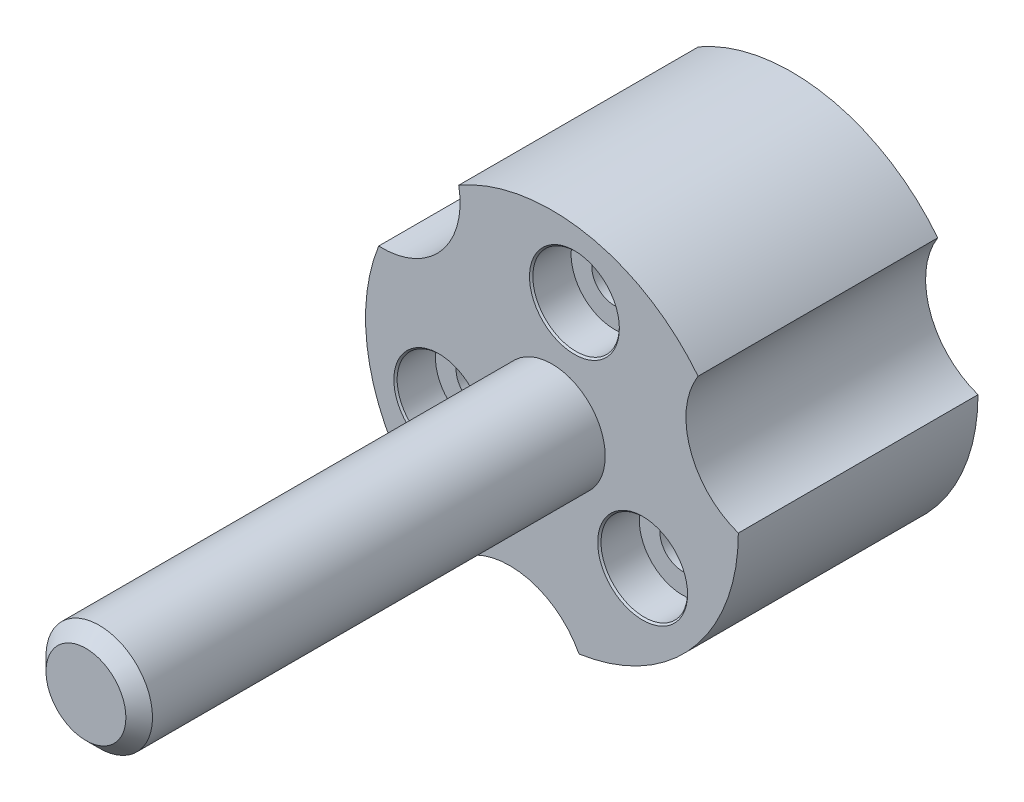
ISO-10303-21;
HEADER;
FILE_DESCRIPTION(('STEP AP214'),'2;1');
FILE_NAME('part.step','',(''),(''),'','','');
FILE_SCHEMA(('AUTOMOTIVE_DESIGN { 1 0 10303 214 1 1 1 1 }'));
ENDSEC;
DATA;
#1=APPLICATION_CONTEXT('core data for automotive mechanical design processes');
#2=APPLICATION_PROTOCOL_DEFINITION('international standard','automotive_design',2000,#1);
#3=PRODUCT_CONTEXT('',#1,'mechanical');
#4=PRODUCT('Part','Part','',(#3));
#5=PRODUCT_RELATED_PRODUCT_CATEGORY('part','',(#4));
#6=PRODUCT_DEFINITION_FORMATION('','',#4);
#7=PRODUCT_DEFINITION_CONTEXT('part definition',#1,'design');
#8=PRODUCT_DEFINITION('design','',#6,#7);
#9=PRODUCT_DEFINITION_SHAPE('','',#8);
#10=(LENGTH_UNIT() NAMED_UNIT(*) SI_UNIT(.MILLI.,.METRE.));
#11=(NAMED_UNIT(*) PLANE_ANGLE_UNIT() SI_UNIT($,.RADIAN.));
#12=(NAMED_UNIT(*) SI_UNIT($,.STERADIAN.) SOLID_ANGLE_UNIT());
#13=UNCERTAINTY_MEASURE_WITH_UNIT(LENGTH_MEASURE(1.E-05),#10,'distance_accuracy_value','');
#14=(GEOMETRIC_REPRESENTATION_CONTEXT(3) GLOBAL_UNCERTAINTY_ASSIGNED_CONTEXT((#13)) GLOBAL_UNIT_ASSIGNED_CONTEXT((#10,
#11,#12)) REPRESENTATION_CONTEXT('',''));
#15=CARTESIAN_POINT('',(0.,0.,0.));
#16=DIRECTION('',(0.,0.,1.));
#17=DIRECTION('',(1.,0.,0.));
#18=AXIS2_PLACEMENT_3D('',#15,#16,#17);
#19=CARTESIAN_POINT('',(-3.16654920409243,-16.571487525007,18.));
#20=DIRECTION('',(0.,0.,-1.));
#21=DIRECTION('',(-1.,0.,0.));
#22=AXIS2_PLACEMENT_3D('',#19,#20,#21);
#23=CYLINDRICAL_SURFACE('',#22,5.87131389825349);
#24=CARTESIAN_POINT('',(-3.16654920409243,-16.571487525007,0.));
#25=DIRECTION('',(0.,0.,1.));
#26=DIRECTION('',(1.,0.,0.));
#27=AXIS2_PLACEMENT_3D('',#24,#25,#26);
#28=CIRCLE('',#27,5.87131389825349);
#29=CARTESIAN_POINT('',(-7.00000000000006,-12.1243556529821,0.));
#30=VERTEX_POINT('',#29);
#31=CARTESIAN_POINT('',(2.03650338968833,-13.851088547251,0.));
#32=VERTEX_POINT('',#31);
#33=EDGE_CURVE('E123',#30,#32,#28,.F.);
#34=ORIENTED_EDGE('',*,*,#33,.T.);
#35=DIRECTION('',(0.,0.,-1.));
#36=VECTOR('',#35,1.);
#37=CARTESIAN_POINT('',(2.03650338968833,-13.851088547251,18.));
#38=LINE('',#37,#36);
#39=CARTESIAN_POINT('',(2.03650338968833,-13.851088547251,18.));
#40=VERTEX_POINT('',#39);
#41=EDGE_CURVE('E141',#40,#32,#38,.T.);
#42=ORIENTED_EDGE('',*,*,#41,.F.);
#43=CARTESIAN_POINT('',(-3.16654920409243,-16.571487525007,18.));
#44=DIRECTION('',(0.,0.,1.));
#45=DIRECTION('',(1.,0.,0.));
#46=AXIS2_PLACEMENT_3D('',#43,#44,#45);
#47=CIRCLE('',#46,5.87131389825349);
#48=CARTESIAN_POINT('',(-7.00000000000006,-12.1243556529821,18.));
#49=VERTEX_POINT('',#48);
#50=EDGE_CURVE('E134',#49,#40,#47,.F.);
#51=ORIENTED_EDGE('',*,*,#50,.F.);
#52=DIRECTION('',(0.,0.,-1.));
#53=VECTOR('',#52,1.);
#54=CARTESIAN_POINT('',(-7.00000000000006,-12.1243556529821,18.));
#55=LINE('',#54,#53);
#56=EDGE_CURVE('E119',#49,#30,#55,.T.);
#57=ORIENTED_EDGE('',*,*,#56,.T.);
#58=EDGE_LOOP('',(#34,#42,#51,#57));
#59=FACE_BOUND('',#58,.T.);
#60=ADVANCED_FACE('F36',(#59),#23,.F.);
#61=CARTESIAN_POINT('',(0.,0.,18.));
#62=DIRECTION('',(0.,0.,-1.));
#63=DIRECTION('',(-1.,0.,0.));
#64=AXIS2_PLACEMENT_3D('',#61,#62,#63);
#65=CYLINDRICAL_SURFACE('',#64,14.);
#66=CARTESIAN_POINT('',(0.,0.,0.));
#67=DIRECTION('',(0.,0.,1.));
#68=DIRECTION('',(1.,0.,0.));
#69=AXIS2_PLACEMENT_3D('',#66,#67,#68);
#70=CIRCLE('',#69,14.);
#71=CARTESIAN_POINT('',(14.,0.,0.));
#72=VERTEX_POINT('',#71);
#73=EDGE_CURVE('E126',#32,#72,#70,.T.);
#74=ORIENTED_EDGE('',*,*,#73,.T.);
#75=DIRECTION('',(0.,0.,-1.));
#76=VECTOR('',#75,1.);
#77=CARTESIAN_POINT('',(14.,0.,18.));
#78=LINE('',#77,#76);
#79=CARTESIAN_POINT('',(14.,0.,18.));
#80=VERTEX_POINT('',#79);
#81=EDGE_CURVE('E138',#80,#72,#78,.T.);
#82=ORIENTED_EDGE('',*,*,#81,.F.);
#83=CARTESIAN_POINT('',(0.,0.,18.));
#84=DIRECTION('',(0.,0.,1.));
#85=DIRECTION('',(1.,0.,0.));
#86=AXIS2_PLACEMENT_3D('',#83,#84,#85);
#87=CIRCLE('',#86,14.);
#88=EDGE_CURVE('E92',#40,#80,#87,.T.);
#89=ORIENTED_EDGE('',*,*,#88,.F.);
#90=ORIENTED_EDGE('',*,*,#41,.T.);
#91=EDGE_LOOP('',(#74,#82,#89,#90));
#92=FACE_BOUND('',#91,.T.);
#93=ADVANCED_FACE('F157',(#92),#65,.T.);
#94=CARTESIAN_POINT('',(15.9346037771992,5.54343170942614,18.));
#95=DIRECTION('',(0.,0.,-1.));
#96=DIRECTION('',(-1.,0.,0.));
#97=AXIS2_PLACEMENT_3D('',#94,#95,#96);
#98=CYLINDRICAL_SURFACE('',#97,5.87131389825349);
#99=CARTESIAN_POINT('',(15.9346037771992,5.54343170942614,0.));
#100=DIRECTION('',(0.,0.,1.));
#101=DIRECTION('',(1.,0.,0.));
#102=AXIS2_PLACEMENT_3D('',#99,#100,#101);
#103=CIRCLE('',#102,5.87131389825349);
#104=CARTESIAN_POINT('',(10.9771428571429,8.68920794398877,0.));
#105=VERTEX_POINT('',#104);
#106=EDGE_CURVE('E129',#72,#105,#103,.F.);
#107=ORIENTED_EDGE('',*,*,#106,.T.);
#108=DIRECTION('',(0.,0.,-1.));
#109=VECTOR('',#108,1.);
#110=CARTESIAN_POINT('',(10.9771428571429,8.68920794398877,18.));
#111=LINE('',#110,#109);
#112=CARTESIAN_POINT('',(10.9771428571429,8.68920794398877,18.));
#113=VERTEX_POINT('',#112);
#114=EDGE_CURVE('E114',#113,#105,#111,.T.);
#115=ORIENTED_EDGE('',*,*,#114,.F.);
#116=CARTESIAN_POINT('',(15.9346037771992,5.54343170942614,18.));
#117=DIRECTION('',(0.,0.,1.));
#118=DIRECTION('',(1.,0.,0.));
#119=AXIS2_PLACEMENT_3D('',#116,#117,#118);
#120=CIRCLE('',#119,5.87131389825349);
#121=EDGE_CURVE('E105',#80,#113,#120,.F.);
#122=ORIENTED_EDGE('',*,*,#121,.F.);
#123=ORIENTED_EDGE('',*,*,#81,.T.);
#124=EDGE_LOOP('',(#107,#115,#122,#123));
#125=FACE_BOUND('',#124,.T.);
#126=ADVANCED_FACE('F160',(#125),#98,.F.);
#127=CARTESIAN_POINT('',(0.,0.,18.));
#128=DIRECTION('',(0.,0.,-1.));
#129=DIRECTION('',(-1.,0.,0.));
#130=AXIS2_PLACEMENT_3D('',#127,#128,#129);
#131=CYLINDRICAL_SURFACE('',#130,14.);
#132=CARTESIAN_POINT('',(0.,0.,0.));
#133=DIRECTION('',(0.,0.,1.));
#134=DIRECTION('',(1.,0.,0.));
#135=AXIS2_PLACEMENT_3D('',#132,#133,#134);
#136=CIRCLE('',#135,14.);
#137=CARTESIAN_POINT('',(-6.99999999999988,12.1243556529822,0.));
#138=VERTEX_POINT('',#137);
#139=EDGE_CURVE('E113',#105,#138,#136,.T.);
#140=ORIENTED_EDGE('',*,*,#139,.T.);
#141=DIRECTION('',(0.,0.,-1.));
#142=VECTOR('',#141,1.);
#143=CARTESIAN_POINT('',(-6.99999999999988,12.1243556529822,18.));
#144=LINE('',#143,#142);
#145=CARTESIAN_POINT('',(-6.99999999999988,12.1243556529822,18.));
#146=VERTEX_POINT('',#145);
#147=EDGE_CURVE('E110',#146,#138,#144,.T.);
#148=ORIENTED_EDGE('',*,*,#147,.F.);
#149=CARTESIAN_POINT('',(0.,0.,18.));
#150=DIRECTION('',(0.,0.,1.));
#151=DIRECTION('',(1.,0.,0.));
#152=AXIS2_PLACEMENT_3D('',#149,#150,#151);
#153=CIRCLE('',#152,14.);
#154=EDGE_CURVE('E99',#113,#146,#153,.T.);
#155=ORIENTED_EDGE('',*,*,#154,.F.);
#156=ORIENTED_EDGE('',*,*,#114,.T.);
#157=EDGE_LOOP('',(#140,#148,#155,#156));
#158=FACE_BOUND('',#157,.T.);
#159=ADVANCED_FACE('F111',(#158),#131,.T.);
#160=CARTESIAN_POINT('',(-12.7680545731067,11.028055815581,18.));
#161=DIRECTION('',(0.,0.,-1.));
#162=DIRECTION('',(-1.,0.,0.));
#163=AXIS2_PLACEMENT_3D('',#160,#161,#162);
#164=CYLINDRICAL_SURFACE('',#163,5.87131389825349);
#165=CARTESIAN_POINT('',(-12.7680545731067,11.028055815581,0.));
#166=DIRECTION('',(0.,0.,1.));
#167=DIRECTION('',(1.,0.,0.));
#168=AXIS2_PLACEMENT_3D('',#165,#166,#167);
#169=CIRCLE('',#168,5.87131389825349);
#170=CARTESIAN_POINT('',(-13.0136462468312,5.16188060326235,0.));
#171=VERTEX_POINT('',#170);
#172=EDGE_CURVE('E77',#138,#171,#169,.F.);
#173=ORIENTED_EDGE('',*,*,#172,.T.);
#174=DIRECTION('',(0.,0.,-1.));
#175=VECTOR('',#174,1.);
#176=CARTESIAN_POINT('',(-13.0136462468312,5.16188060326235,18.));
#177=LINE('',#176,#175);
#178=CARTESIAN_POINT('',(-13.0136462468312,5.16188060326235,18.));
#179=VERTEX_POINT('',#178);
#180=EDGE_CURVE('E115',#179,#171,#177,.T.);
#181=ORIENTED_EDGE('',*,*,#180,.F.);
#182=CARTESIAN_POINT('',(-12.7680545731067,11.028055815581,18.));
#183=DIRECTION('',(0.,0.,1.));
#184=DIRECTION('',(1.,0.,0.));
#185=AXIS2_PLACEMENT_3D('',#182,#183,#184);
#186=CIRCLE('',#185,5.87131389825349);
#187=EDGE_CURVE('E103',#146,#179,#186,.F.);
#188=ORIENTED_EDGE('',*,*,#187,.F.);
#189=ORIENTED_EDGE('',*,*,#147,.T.);
#190=EDGE_LOOP('',(#173,#181,#188,#189));
#191=FACE_BOUND('',#190,.T.);
#192=ADVANCED_FACE('F117',(#191),#164,.F.);
#193=CARTESIAN_POINT('',(0.,0.,18.));
#194=DIRECTION('',(0.,0.,-1.));
#195=DIRECTION('',(-1.,0.,0.));
#196=AXIS2_PLACEMENT_3D('',#193,#194,#195);
#197=CYLINDRICAL_SURFACE('',#196,14.);
#198=CARTESIAN_POINT('',(0.,0.,0.));
#199=DIRECTION('',(0.,0.,1.));
#200=DIRECTION('',(1.,0.,0.));
#201=AXIS2_PLACEMENT_3D('',#198,#199,#200);
#202=CIRCLE('',#201,14.);
#203=EDGE_CURVE('E83',#171,#30,#202,.T.);
#204=ORIENTED_EDGE('',*,*,#203,.T.);
#205=ORIENTED_EDGE('',*,*,#56,.F.);
#206=CARTESIAN_POINT('',(0.,0.,18.));
#207=DIRECTION('',(0.,0.,1.));
#208=DIRECTION('',(1.,0.,0.));
#209=AXIS2_PLACEMENT_3D('',#206,#207,#208);
#210=CIRCLE('',#209,14.);
#211=EDGE_CURVE('E54',#179,#49,#210,.T.);
#212=ORIENTED_EDGE('',*,*,#211,.F.);
#213=ORIENTED_EDGE('',*,*,#180,.T.);
#214=EDGE_LOOP('',(#204,#205,#212,#213));
#215=FACE_BOUND('',#214,.T.);
#216=ADVANCED_FACE('F165',(#215),#197,.T.);
#217=CARTESIAN_POINT('',(0.,0.,18.));
#218=DIRECTION('',(0.,0.,1.));
#219=DIRECTION('',(1.,0.,0.));
#220=AXIS2_PLACEMENT_3D('',#217,#218,#219);
#221=PLANE('',#220);
#222=CARTESIAN_POINT('',(-8.50031211911943,-2.95714285714291,18.));
#223=DIRECTION('',(0.,0.,1.));
#224=DIRECTION('',(1.,0.,0.));
#225=AXIS2_PLACEMENT_3D('',#222,#223,#224);
#226=CIRCLE('',#225,3.375);
#227=CARTESIAN_POINT('',(-5.12531211911943,-2.95714285714291,18.));
#228=VERTEX_POINT('',#227);
#229=EDGE_CURVE('E414',#228,#228,#226,.T.);
#230=ORIENTED_EDGE('',*,*,#229,.F.);
#231=EDGE_LOOP('',(#230));
#232=FACE_BOUND('',#231,.T.);
#233=CARTESIAN_POINT('',(1.6891952226543,8.84005766382561,18.));
#234=DIRECTION('',(0.,0.,1.));
#235=DIRECTION('',(1.,0.,0.));
#236=AXIS2_PLACEMENT_3D('',#233,#234,#235);
#237=CIRCLE('',#236,3.375);
#238=CARTESIAN_POINT('',(5.06419522265429,8.84005766382561,18.));
#239=VERTEX_POINT('',#238);
#240=EDGE_CURVE('E431',#239,#239,#237,.T.);
#241=ORIENTED_EDGE('',*,*,#240,.F.);
#242=EDGE_LOOP('',(#241));
#243=FACE_BOUND('',#242,.T.);
#244=CARTESIAN_POINT('',(6.81111689646512,-5.88291480668277,18.));
#245=DIRECTION('',(0.,0.,1.));
#246=DIRECTION('',(1.,0.,0.));
#247=AXIS2_PLACEMENT_3D('',#244,#245,#246);
#248=CIRCLE('',#247,3.375);
#249=CARTESIAN_POINT('',(10.1861168964651,-5.88291480668277,18.));
#250=VERTEX_POINT('',#249);
#251=EDGE_CURVE('E446',#250,#250,#248,.T.);
#252=ORIENTED_EDGE('',*,*,#251,.F.);
#253=EDGE_LOOP('',(#252));
#254=FACE_BOUND('',#253,.T.);
#255=CARTESIAN_POINT('',(0.,0.,18.));
#256=DIRECTION('',(0.,0.,1.));
#257=DIRECTION('',(1.,0.,0.));
#258=AXIS2_PLACEMENT_3D('',#255,#256,#257);
#259=CIRCLE('',#258,4.);
#260=CARTESIAN_POINT('',(4.,0.,18.));
#261=VERTEX_POINT('',#260);
#262=EDGE_CURVE('E143',#261,#261,#259,.T.);
#263=ORIENTED_EDGE('',*,*,#262,.F.);
#264=EDGE_LOOP('',(#263));
#265=FACE_BOUND('',#264,.T.);
#266=ORIENTED_EDGE('',*,*,#50,.T.);
#267=ORIENTED_EDGE('',*,*,#88,.T.);
#268=ORIENTED_EDGE('',*,*,#121,.T.);
#269=ORIENTED_EDGE('',*,*,#154,.T.);
#270=ORIENTED_EDGE('',*,*,#187,.T.);
#271=ORIENTED_EDGE('',*,*,#211,.T.);
#272=EDGE_LOOP('',(#266,#267,#268,#269,#270,#271));
#273=FACE_BOUND('',#272,.T.);
#274=ADVANCED_FACE('F101',(#232,#243,#254,#265,#273),#221,.T.);
#275=CARTESIAN_POINT('',(0.,0.,0.));
#276=DIRECTION('',(0.,0.,1.));
#277=DIRECTION('',(1.,0.,0.));
#278=AXIS2_PLACEMENT_3D('',#275,#276,#277);
#279=PLANE('',#278);
#280=CARTESIAN_POINT('',(0.,0.,0.));
#281=DIRECTION('',(0.,0.,-1.));
#282=DIRECTION('',(-1.,0.,0.));
#283=AXIS2_PLACEMENT_3D('',#280,#281,#282);
#284=CIRCLE('',#283,6.);
#285=CARTESIAN_POINT('',(-6.,0.,0.));
#286=VERTEX_POINT('',#285);
#287=EDGE_CURVE('E409',#286,#286,#284,.T.);
#288=ORIENTED_EDGE('',*,*,#287,.F.);
#289=EDGE_LOOP('',(#288));
#290=FACE_BOUND('',#289,.T.);
#291=CARTESIAN_POINT('',(-8.50031211911943,-2.95714285714291,0.));
#292=DIRECTION('',(0.,0.,1.));
#293=DIRECTION('',(1.,0.,0.));
#294=AXIS2_PLACEMENT_3D('',#291,#292,#293);
#295=CIRCLE('',#294,1.7);
#296=CARTESIAN_POINT('',(-6.80031211911943,-2.95714285714291,0.));
#297=VERTEX_POINT('',#296);
#298=EDGE_CURVE('E428',#297,#297,#295,.T.);
#299=ORIENTED_EDGE('',*,*,#298,.T.);
#300=EDGE_LOOP('',(#299));
#301=FACE_BOUND('',#300,.T.);
#302=CARTESIAN_POINT('',(1.6891952226543,8.84005766382561,0.));
#303=DIRECTION('',(0.,0.,1.));
#304=DIRECTION('',(1.,0.,0.));
#305=AXIS2_PLACEMENT_3D('',#302,#303,#304);
#306=CIRCLE('',#305,1.7);
#307=CARTESIAN_POINT('',(3.38919522265429,8.84005766382561,0.));
#308=VERTEX_POINT('',#307);
#309=EDGE_CURVE('E443',#308,#308,#306,.T.);
#310=ORIENTED_EDGE('',*,*,#309,.T.);
#311=EDGE_LOOP('',(#310));
#312=FACE_BOUND('',#311,.T.);
#313=CARTESIAN_POINT('',(6.81111689646512,-5.88291480668277,0.));
#314=DIRECTION('',(0.,0.,1.));
#315=DIRECTION('',(1.,0.,0.));
#316=AXIS2_PLACEMENT_3D('',#313,#314,#315);
#317=CIRCLE('',#316,1.69999999999999);
#318=CARTESIAN_POINT('',(8.51111689646511,-5.88291480668277,0.));
#319=VERTEX_POINT('',#318);
#320=EDGE_CURVE('E127',#319,#319,#317,.T.);
#321=ORIENTED_EDGE('',*,*,#320,.T.);
#322=EDGE_LOOP('',(#321));
#323=FACE_BOUND('',#322,.T.);
#324=ORIENTED_EDGE('',*,*,#33,.F.);
#325=ORIENTED_EDGE('',*,*,#203,.F.);
#326=ORIENTED_EDGE('',*,*,#172,.F.);
#327=ORIENTED_EDGE('',*,*,#139,.F.);
#328=ORIENTED_EDGE('',*,*,#106,.F.);
#329=ORIENTED_EDGE('',*,*,#73,.F.);
#330=EDGE_LOOP('',(#324,#325,#326,#327,#328,#329));
#331=FACE_BOUND('',#330,.T.);
#332=ADVANCED_FACE('F163',(#290,#301,#312,#323,#331),#279,.F.);
#333=CARTESIAN_POINT('',(0.,0.,53.));
#334=DIRECTION('',(0.,0.,-1.));
#335=DIRECTION('',(-1.,0.,0.));
#336=AXIS2_PLACEMENT_3D('',#333,#334,#335);
#337=CYLINDRICAL_SURFACE('',#336,4.);
#338=CARTESIAN_POINT('',(0.,0.,52.));
#339=DIRECTION('',(0.,0.,1.));
#340=DIRECTION('',(1.,0.,0.));
#341=AXIS2_PLACEMENT_3D('',#338,#339,#340);
#342=CIRCLE('',#341,4.);
#343=CARTESIAN_POINT('',(4.,0.,52.));
#344=VERTEX_POINT('',#343);
#345=EDGE_CURVE('E11',#344,#344,#342,.F.);
#346=ORIENTED_EDGE('',*,*,#345,.T.);
#347=EDGE_LOOP('',(#346));
#348=FACE_BOUND('',#347,.T.);
#349=ORIENTED_EDGE('',*,*,#262,.T.);
#350=EDGE_LOOP('',(#349));
#351=FACE_BOUND('',#350,.T.);
#352=ADVANCED_FACE('F203',(#348,#351),#337,.T.);
#353=CARTESIAN_POINT('',(0.,0.,53.));
#354=DIRECTION('',(0.,0.,1.));
#355=DIRECTION('',(1.,0.,0.));
#356=AXIS2_PLACEMENT_3D('',#353,#354,#355);
#357=PLANE('',#356);
#358=CARTESIAN_POINT('',(0.,0.,53.));
#359=DIRECTION('',(0.,0.,1.));
#360=DIRECTION('',(1.,0.,0.));
#361=AXIS2_PLACEMENT_3D('',#358,#359,#360);
#362=CIRCLE('',#361,2.99999999999999);
#363=CARTESIAN_POINT('',(2.99999999999999,0.,53.));
#364=VERTEX_POINT('',#363);
#365=EDGE_CURVE('E46',#364,#364,#362,.T.);
#366=ORIENTED_EDGE('',*,*,#365,.T.);
#367=EDGE_LOOP('',(#366));
#368=FACE_BOUND('',#367,.T.);
#369=ADVANCED_FACE('F209',(#368),#357,.T.);
#370=CARTESIAN_POINT('',(0.,0.,53.));
#371=DIRECTION('',(0.,0.,-1.));
#372=DIRECTION('',(-1.,0.,0.));
#373=AXIS2_PLACEMENT_3D('',#370,#371,#372);
#374=CONICAL_SURFACE('',#373,2.99999999999999,0.78539816339745);
#375=ORIENTED_EDGE('',*,*,#345,.F.);
#376=EDGE_LOOP('',(#375));
#377=FACE_BOUND('',#376,.T.);
#378=ORIENTED_EDGE('',*,*,#365,.F.);
#379=EDGE_LOOP('',(#378));
#380=FACE_BOUND('',#379,.T.);
#381=ADVANCED_FACE('F38',(#377,#380),#374,.T.);
#382=CARTESIAN_POINT('',(6.81111689646512,-5.88291480668277,18.));
#383=DIRECTION('',(0.,0.,1.));
#384=DIRECTION('',(1.,0.,0.));
#385=AXIS2_PLACEMENT_3D('',#382,#383,#384);
#386=CYLINDRICAL_SURFACE('',#385,1.7);
#387=ORIENTED_EDGE('',*,*,#320,.F.);
#388=EDGE_LOOP('',(#387));
#389=FACE_BOUND('',#388,.T.);
#390=CARTESIAN_POINT('',(6.81111689646512,-5.88291480668277,15.));
#391=DIRECTION('',(0.,0.,1.));
#392=DIRECTION('',(1.,0.,0.));
#393=AXIS2_PLACEMENT_3D('',#390,#391,#392);
#394=CIRCLE('',#393,1.7);
#395=CARTESIAN_POINT('',(8.51111689646512,-5.88291480668277,15.));
#396=VERTEX_POINT('',#395);
#397=EDGE_CURVE('E454',#396,#396,#394,.T.);
#398=ORIENTED_EDGE('',*,*,#397,.T.);
#399=EDGE_LOOP('',(#398));
#400=FACE_BOUND('',#399,.T.);
#401=ADVANCED_FACE('F227',(#389,#400),#386,.F.);
#402=CARTESIAN_POINT('',(10.0611168964651,-5.88291480668277,15.));
#403=DIRECTION('',(0.,0.,-1.));
#404=DIRECTION('',(-1.,0.,0.));
#405=AXIS2_PLACEMENT_3D('',#402,#403,#404);
#406=PLANE('',#405);
#407=ORIENTED_EDGE('',*,*,#397,.F.);
#408=EDGE_LOOP('',(#407));
#409=FACE_BOUND('',#408,.T.);
#410=CARTESIAN_POINT('',(6.81111689646512,-5.88291480668277,15.));
#411=DIRECTION('',(0.,0.,1.));
#412=DIRECTION('',(1.,0.,0.));
#413=AXIS2_PLACEMENT_3D('',#410,#411,#412);
#414=CIRCLE('',#413,3.25);
#415=CARTESIAN_POINT('',(10.0611168964651,-5.88291480668277,15.));
#416=VERTEX_POINT('',#415);
#417=EDGE_CURVE('E452',#416,#416,#414,.T.);
#418=ORIENTED_EDGE('',*,*,#417,.T.);
#419=EDGE_LOOP('',(#418));
#420=FACE_BOUND('',#419,.T.);
#421=ADVANCED_FACE('F236',(#409,#420),#406,.F.);
#422=CARTESIAN_POINT('',(6.81111689646512,-5.88291480668277,18.));
#423=DIRECTION('',(0.,0.,1.));
#424=DIRECTION('',(1.,0.,0.));
#425=AXIS2_PLACEMENT_3D('',#422,#423,#424);
#426=CYLINDRICAL_SURFACE('',#425,3.25);
#427=ORIENTED_EDGE('',*,*,#417,.F.);
#428=EDGE_LOOP('',(#427));
#429=FACE_BOUND('',#428,.T.);
#430=CARTESIAN_POINT('',(6.81111689646512,-5.88291480668277,17.875));
#431=DIRECTION('',(0.,0.,1.));
#432=DIRECTION('',(1.,0.,0.));
#433=AXIS2_PLACEMENT_3D('',#430,#431,#432);
#434=CIRCLE('',#433,3.25);
#435=CARTESIAN_POINT('',(10.0611168964651,-5.88291480668277,17.875));
#436=VERTEX_POINT('',#435);
#437=EDGE_CURVE('E449',#436,#436,#434,.T.);
#438=ORIENTED_EDGE('',*,*,#437,.T.);
#439=EDGE_LOOP('',(#438));
#440=FACE_BOUND('',#439,.T.);
#441=ADVANCED_FACE('F246',(#429,#440),#426,.F.);
#442=CARTESIAN_POINT('',(6.81111689646512,-5.88291480668277,18.));
#443=DIRECTION('',(0.,0.,1.));
#444=DIRECTION('',(1.,0.,0.));
#445=AXIS2_PLACEMENT_3D('',#442,#443,#444);
#446=CONICAL_SURFACE('',#445,3.375,0.785398163397448);
#447=ORIENTED_EDGE('',*,*,#437,.F.);
#448=EDGE_LOOP('',(#447));
#449=FACE_BOUND('',#448,.T.);
#450=ORIENTED_EDGE('',*,*,#251,.T.);
#451=EDGE_LOOP('',(#450));
#452=FACE_BOUND('',#451,.T.);
#453=ADVANCED_FACE('F256',(#449,#452),#446,.F.);
#454=CARTESIAN_POINT('',(1.6891952226543,8.84005766382561,18.));
#455=DIRECTION('',(0.,0.,1.));
#456=DIRECTION('',(1.,0.,0.));
#457=AXIS2_PLACEMENT_3D('',#454,#455,#456);
#458=CYLINDRICAL_SURFACE('',#457,1.7);
#459=ORIENTED_EDGE('',*,*,#309,.F.);
#460=EDGE_LOOP('',(#459));
#461=FACE_BOUND('',#460,.T.);
#462=CARTESIAN_POINT('',(1.6891952226543,8.84005766382561,15.));
#463=DIRECTION('',(0.,0.,1.));
#464=DIRECTION('',(1.,0.,0.));
#465=AXIS2_PLACEMENT_3D('',#462,#463,#464);
#466=CIRCLE('',#465,1.7);
#467=CARTESIAN_POINT('',(3.3891952226543,8.84005766382561,15.));
#468=VERTEX_POINT('',#467);
#469=EDGE_CURVE('E440',#468,#468,#466,.T.);
#470=ORIENTED_EDGE('',*,*,#469,.T.);
#471=EDGE_LOOP('',(#470));
#472=FACE_BOUND('',#471,.T.);
#473=ADVANCED_FACE('F266',(#461,#472),#458,.F.);
#474=CARTESIAN_POINT('',(4.93919522265429,8.84005766382561,15.));
#475=DIRECTION('',(0.,0.,-1.));
#476=DIRECTION('',(-1.,0.,0.));
#477=AXIS2_PLACEMENT_3D('',#474,#475,#476);
#478=PLANE('',#477);
#479=ORIENTED_EDGE('',*,*,#469,.F.);
#480=EDGE_LOOP('',(#479));
#481=FACE_BOUND('',#480,.T.);
#482=CARTESIAN_POINT('',(1.6891952226543,8.84005766382561,15.));
#483=DIRECTION('',(0.,0.,1.));
#484=DIRECTION('',(1.,0.,0.));
#485=AXIS2_PLACEMENT_3D('',#482,#483,#484);
#486=CIRCLE('',#485,3.25);
#487=CARTESIAN_POINT('',(4.93919522265429,8.84005766382561,15.));
#488=VERTEX_POINT('',#487);
#489=EDGE_CURVE('E437',#488,#488,#486,.T.);
#490=ORIENTED_EDGE('',*,*,#489,.T.);
#491=EDGE_LOOP('',(#490));
#492=FACE_BOUND('',#491,.T.);
#493=ADVANCED_FACE('F283',(#481,#492),#478,.F.);
#494=CARTESIAN_POINT('',(1.6891952226543,8.84005766382561,18.));
#495=DIRECTION('',(0.,0.,1.));
#496=DIRECTION('',(1.,0.,0.));
#497=AXIS2_PLACEMENT_3D('',#494,#495,#496);
#498=CYLINDRICAL_SURFACE('',#497,3.25);
#499=ORIENTED_EDGE('',*,*,#489,.F.);
#500=EDGE_LOOP('',(#499));
#501=FACE_BOUND('',#500,.T.);
#502=CARTESIAN_POINT('',(1.6891952226543,8.84005766382561,17.875));
#503=DIRECTION('',(0.,0.,1.));
#504=DIRECTION('',(1.,0.,0.));
#505=AXIS2_PLACEMENT_3D('',#502,#503,#504);
#506=CIRCLE('',#505,3.25);
#507=CARTESIAN_POINT('',(4.9391952226543,8.84005766382561,17.875));
#508=VERTEX_POINT('',#507);
#509=EDGE_CURVE('E434',#508,#508,#506,.T.);
#510=ORIENTED_EDGE('',*,*,#509,.T.);
#511=EDGE_LOOP('',(#510));
#512=FACE_BOUND('',#511,.T.);
#513=ADVANCED_FACE('F293',(#501,#512),#498,.F.);
#514=CARTESIAN_POINT('',(1.6891952226543,8.84005766382561,18.));
#515=DIRECTION('',(0.,0.,1.));
#516=DIRECTION('',(1.,0.,0.));
#517=AXIS2_PLACEMENT_3D('',#514,#515,#516);
#518=CONICAL_SURFACE('',#517,3.375,0.785398163397445);
#519=ORIENTED_EDGE('',*,*,#509,.F.);
#520=EDGE_LOOP('',(#519));
#521=FACE_BOUND('',#520,.T.);
#522=ORIENTED_EDGE('',*,*,#240,.T.);
#523=EDGE_LOOP('',(#522));
#524=FACE_BOUND('',#523,.T.);
#525=ADVANCED_FACE('F303',(#521,#524),#518,.F.);
#526=CARTESIAN_POINT('',(-8.50031211911943,-2.95714285714291,18.));
#527=DIRECTION('',(0.,0.,1.));
#528=DIRECTION('',(1.,0.,0.));
#529=AXIS2_PLACEMENT_3D('',#526,#527,#528);
#530=CYLINDRICAL_SURFACE('',#529,1.7);
#531=ORIENTED_EDGE('',*,*,#298,.F.);
#532=EDGE_LOOP('',(#531));
#533=FACE_BOUND('',#532,.T.);
#534=CARTESIAN_POINT('',(-8.50031211911943,-2.95714285714291,15.));
#535=DIRECTION('',(0.,0.,1.));
#536=DIRECTION('',(1.,0.,0.));
#537=AXIS2_PLACEMENT_3D('',#534,#535,#536);
#538=CIRCLE('',#537,1.7);
#539=CARTESIAN_POINT('',(-6.80031211911943,-2.95714285714291,15.));
#540=VERTEX_POINT('',#539);
#541=EDGE_CURVE('E425',#540,#540,#538,.T.);
#542=ORIENTED_EDGE('',*,*,#541,.T.);
#543=EDGE_LOOP('',(#542));
#544=FACE_BOUND('',#543,.T.);
#545=ADVANCED_FACE('F313',(#533,#544),#530,.F.);
#546=CARTESIAN_POINT('',(-5.25031211911943,-2.95714285714291,15.));
#547=DIRECTION('',(0.,0.,-1.));
#548=DIRECTION('',(-1.,0.,0.));
#549=AXIS2_PLACEMENT_3D('',#546,#547,#548);
#550=PLANE('',#549);
#551=ORIENTED_EDGE('',*,*,#541,.F.);
#552=EDGE_LOOP('',(#551));
#553=FACE_BOUND('',#552,.T.);
#554=CARTESIAN_POINT('',(-8.50031211911943,-2.95714285714291,15.));
#555=DIRECTION('',(0.,0.,1.));
#556=DIRECTION('',(1.,0.,0.));
#557=AXIS2_PLACEMENT_3D('',#554,#555,#556);
#558=CIRCLE('',#557,3.25);
#559=CARTESIAN_POINT('',(-5.25031211911943,-2.95714285714291,15.));
#560=VERTEX_POINT('',#559);
#561=EDGE_CURVE('E422',#560,#560,#558,.T.);
#562=ORIENTED_EDGE('',*,*,#561,.T.);
#563=EDGE_LOOP('',(#562));
#564=FACE_BOUND('',#563,.T.);
#565=ADVANCED_FACE('F323',(#553,#564),#550,.F.);
#566=CARTESIAN_POINT('',(-8.50031211911943,-2.95714285714291,18.));
#567=DIRECTION('',(0.,0.,1.));
#568=DIRECTION('',(1.,0.,0.));
#569=AXIS2_PLACEMENT_3D('',#566,#567,#568);
#570=CYLINDRICAL_SURFACE('',#569,3.25);
#571=ORIENTED_EDGE('',*,*,#561,.F.);
#572=EDGE_LOOP('',(#571));
#573=FACE_BOUND('',#572,.T.);
#574=CARTESIAN_POINT('',(-8.50031211911943,-2.95714285714291,17.875));
#575=DIRECTION('',(0.,0.,1.));
#576=DIRECTION('',(1.,0.,0.));
#577=AXIS2_PLACEMENT_3D('',#574,#575,#576);
#578=CIRCLE('',#577,3.25);
#579=CARTESIAN_POINT('',(-5.25031211911943,-2.95714285714291,17.875));
#580=VERTEX_POINT('',#579);
#581=EDGE_CURVE('E419',#580,#580,#578,.T.);
#582=ORIENTED_EDGE('',*,*,#581,.T.);
#583=EDGE_LOOP('',(#582));
#584=FACE_BOUND('',#583,.T.);
#585=ADVANCED_FACE('F333',(#573,#584),#570,.F.);
#586=CARTESIAN_POINT('',(-8.50031211911943,-2.95714285714291,18.));
#587=DIRECTION('',(0.,0.,1.));
#588=DIRECTION('',(1.,0.,0.));
#589=AXIS2_PLACEMENT_3D('',#586,#587,#588);
#590=CONICAL_SURFACE('',#589,3.375,0.785398163397448);
#591=ORIENTED_EDGE('',*,*,#581,.F.);
#592=EDGE_LOOP('',(#591));
#593=FACE_BOUND('',#592,.T.);
#594=ORIENTED_EDGE('',*,*,#229,.T.);
#595=EDGE_LOOP('',(#594));
#596=FACE_BOUND('',#595,.T.);
#597=ADVANCED_FACE('F343',(#593,#596),#590,.F.);
#598=CARTESIAN_POINT('',(0.,0.,3.));
#599=DIRECTION('',(0.,0.,-1.));
#600=DIRECTION('',(-1.,0.,0.));
#601=AXIS2_PLACEMENT_3D('',#598,#599,#600);
#602=CYLINDRICAL_SURFACE('',#601,6.);
#603=CARTESIAN_POINT('',(0.,0.,3.));
#604=DIRECTION('',(0.,0.,-1.));
#605=DIRECTION('',(-1.,0.,0.));
#606=AXIS2_PLACEMENT_3D('',#603,#604,#605);
#607=CIRCLE('',#606,6.);
#608=CARTESIAN_POINT('',(-6.,0.,3.));
#609=VERTEX_POINT('',#608);
#610=EDGE_CURVE('E411',#609,#609,#607,.T.);
#611=ORIENTED_EDGE('',*,*,#610,.F.);
#612=EDGE_LOOP('',(#611));
#613=FACE_BOUND('',#612,.T.);
#614=ORIENTED_EDGE('',*,*,#287,.T.);
#615=EDGE_LOOP('',(#614));
#616=FACE_BOUND('',#615,.T.);
#617=ADVANCED_FACE('F353',(#613,#616),#602,.F.);
#618=CARTESIAN_POINT('',(0.,0.,3.));
#619=DIRECTION('',(0.,0.,-1.));
#620=DIRECTION('',(-1.,0.,0.));
#621=AXIS2_PLACEMENT_3D('',#618,#619,#620);
#622=PLANE('',#621);
#623=CARTESIAN_POINT('',(0.,0.,3.));
#624=DIRECTION('',(0.,0.,-1.));
#625=DIRECTION('',(-1.,0.,0.));
#626=AXIS2_PLACEMENT_3D('',#623,#624,#625);
#627=CIRCLE('',#626,4.);
#628=CARTESIAN_POINT('',(-4.,0.,3.));
#629=VERTEX_POINT('',#628);
#630=EDGE_CURVE('E40',#629,#629,#627,.T.);
#631=ORIENTED_EDGE('',*,*,#630,.F.);
#632=EDGE_LOOP('',(#631));
#633=FACE_BOUND('',#632,.T.);
#634=ORIENTED_EDGE('',*,*,#610,.T.);
#635=EDGE_LOOP('',(#634));
#636=FACE_BOUND('',#635,.T.);
#637=ADVANCED_FACE('F369',(#633,#636),#622,.T.);
#638=CARTESIAN_POINT('',(0.,0.,14.));
#639=DIRECTION('',(0.,0.,-1.));
#640=DIRECTION('',(-1.,0.,0.));
#641=AXIS2_PLACEMENT_3D('',#638,#639,#640);
#642=CYLINDRICAL_SURFACE('',#641,4.);
#643=ORIENTED_EDGE('',*,*,#630,.T.);
#644=EDGE_LOOP('',(#643));
#645=FACE_BOUND('',#644,.T.);
#646=CARTESIAN_POINT('',(0.,0.,14.));
#647=DIRECTION('',(0.,0.,-1.));
#648=DIRECTION('',(-1.,0.,0.));
#649=AXIS2_PLACEMENT_3D('',#646,#647,#648);
#650=CIRCLE('',#649,4.);
#651=CARTESIAN_POINT('',(-4.,0.,14.));
#652=VERTEX_POINT('',#651);
#653=EDGE_CURVE('E405',#652,#652,#650,.T.);
#654=ORIENTED_EDGE('',*,*,#653,.F.);
#655=EDGE_LOOP('',(#654));
#656=FACE_BOUND('',#655,.T.);
#657=ADVANCED_FACE('F379',(#645,#656),#642,.F.);
#658=CARTESIAN_POINT('',(0.,0.,14.));
#659=DIRECTION('',(0.,0.,-1.));
#660=DIRECTION('',(-1.,0.,0.));
#661=AXIS2_PLACEMENT_3D('',#658,#659,#660);
#662=PLANE('',#661);
#663=ORIENTED_EDGE('',*,*,#653,.T.);
#664=EDGE_LOOP('',(#663));
#665=FACE_BOUND('',#664,.T.);
#666=ADVANCED_FACE('F389',(#665),#662,.T.);
#667=CLOSED_SHELL('',(#60,#93,#126,#159,#192,#216,#274,#332,#352,#369,#381,#401,#421,#441,#453,
#473,#493,#513,#525,#545,#565,#585,#597,#617,#637,#657,#666));
#668=MANIFOLD_SOLID_BREP('B2',#667);
#669=ADVANCED_BREP_SHAPE_REPRESENTATION('',(#18,#668),#14);
#670=SHAPE_DEFINITION_REPRESENTATION(#9,#669);
ENDSEC;
END-ISO-10303-21;
